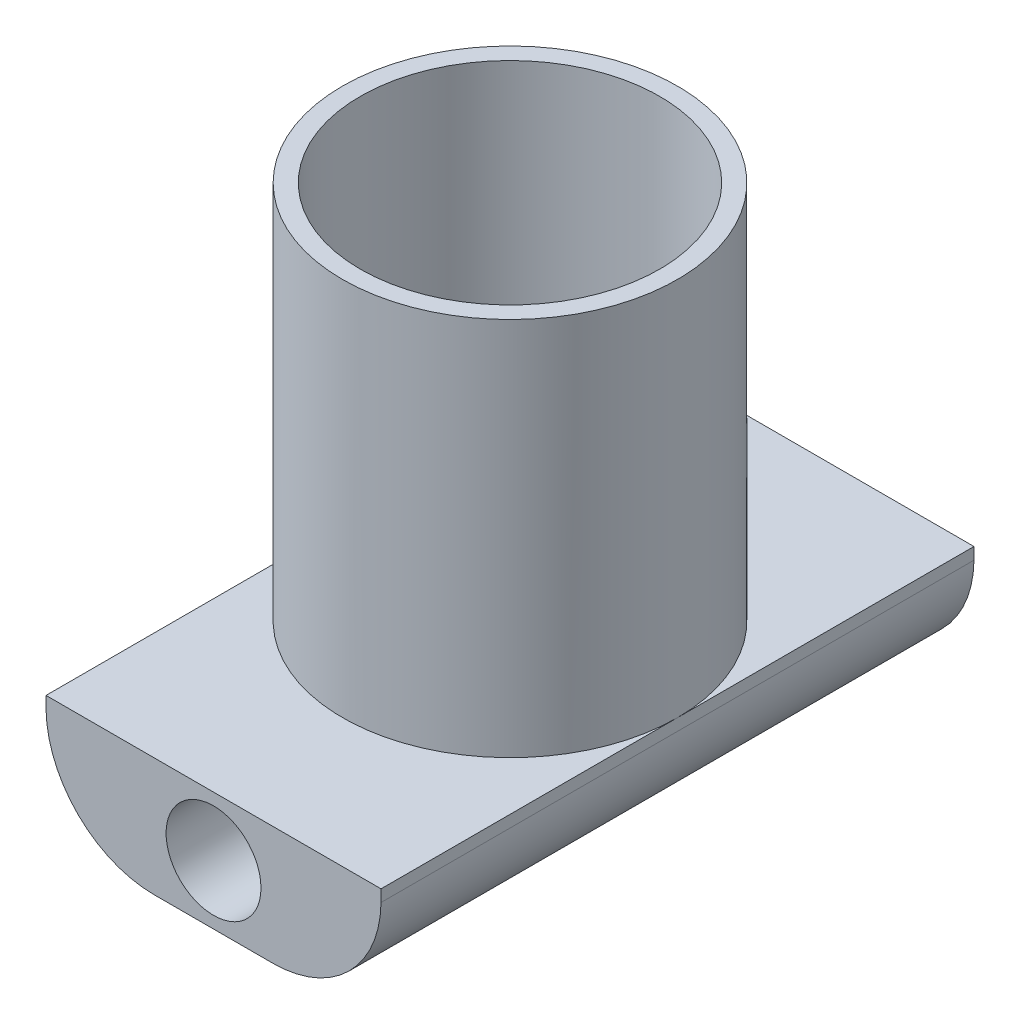
ISO-10303-21;
HEADER;
FILE_DESCRIPTION(('STEP AP214'),'2;1');
FILE_NAME('part.step','',(''),(''),'','','');
FILE_SCHEMA(('AUTOMOTIVE_DESIGN { 1 0 10303 214 1 1 1 1 }'));
ENDSEC;
DATA;
#1=APPLICATION_CONTEXT('core data for automotive mechanical design processes');
#2=APPLICATION_PROTOCOL_DEFINITION('international standard','automotive_design',2000,#1);
#3=PRODUCT_CONTEXT('',#1,'mechanical');
#4=PRODUCT('Part','Part','',(#3));
#5=PRODUCT_RELATED_PRODUCT_CATEGORY('part','',(#4));
#6=PRODUCT_DEFINITION_FORMATION('','',#4);
#7=PRODUCT_DEFINITION_CONTEXT('part definition',#1,'design');
#8=PRODUCT_DEFINITION('design','',#6,#7);
#9=PRODUCT_DEFINITION_SHAPE('','',#8);
#10=(LENGTH_UNIT() NAMED_UNIT(*) SI_UNIT(.MILLI.,.METRE.));
#11=(NAMED_UNIT(*) PLANE_ANGLE_UNIT() SI_UNIT($,.RADIAN.));
#12=(NAMED_UNIT(*) SI_UNIT($,.STERADIAN.) SOLID_ANGLE_UNIT());
#13=UNCERTAINTY_MEASURE_WITH_UNIT(LENGTH_MEASURE(1.E-05),#10,'distance_accuracy_value','');
#14=(GEOMETRIC_REPRESENTATION_CONTEXT(3) GLOBAL_UNCERTAINTY_ASSIGNED_CONTEXT((#13)) GLOBAL_UNIT_ASSIGNED_CONTEXT((#10,
#11,#12)) REPRESENTATION_CONTEXT('',''));
#15=CARTESIAN_POINT('',(0.,0.,0.));
#16=DIRECTION('',(0.,0.,1.));
#17=DIRECTION('',(1.,0.,0.));
#18=AXIS2_PLACEMENT_3D('',#15,#16,#17);
#19=CARTESIAN_POINT('',(0.,30.,0.));
#20=DIRECTION('',(0.,1.,0.));
#21=DIRECTION('',(0.,0.,1.));
#22=AXIS2_PLACEMENT_3D('',#19,#20,#21);
#23=PLANE('',#22);
#24=CARTESIAN_POINT('',(0.,30.,0.));
#25=DIRECTION('',(0.,1.,0.));
#26=DIRECTION('',(0.,0.,1.));
#27=AXIS2_PLACEMENT_3D('',#24,#25,#26);
#28=CIRCLE('',#27,14.125);
#29=CARTESIAN_POINT('',(0.,30.,14.125));
#30=VERTEX_POINT('',#29);
#31=EDGE_CURVE('E162',#30,#30,#28,.T.);
#32=ORIENTED_EDGE('',*,*,#31,.T.);
#33=EDGE_LOOP('',(#32));
#34=FACE_BOUND('',#33,.T.);
#35=CARTESIAN_POINT('',(0.,30.,0.));
#36=DIRECTION('',(0.,1.,0.));
#37=DIRECTION('',(0.,0.,1.));
#38=AXIS2_PLACEMENT_3D('',#35,#36,#37);
#39=CIRCLE('',#38,12.625);
#40=CARTESIAN_POINT('',(0.,30.,12.625));
#41=VERTEX_POINT('',#40);
#42=EDGE_CURVE('E159',#41,#41,#39,.T.);
#43=ORIENTED_EDGE('',*,*,#42,.F.);
#44=EDGE_LOOP('',(#43));
#45=FACE_BOUND('',#44,.T.);
#46=ADVANCED_FACE('F35',(#34,#45),#23,.T.);
#47=CARTESIAN_POINT('',(0.,30.,0.));
#48=DIRECTION('',(0.,-1.,0.));
#49=DIRECTION('',(0.,0.,-1.));
#50=AXIS2_PLACEMENT_3D('',#47,#48,#49);
#51=CYLINDRICAL_SURFACE('',#50,14.125);
#52=CARTESIAN_POINT('',(0.,-2.,0.));
#53=DIRECTION('',(0.,1.,0.));
#54=DIRECTION('',(-1.,0.,0.));
#55=AXIS2_PLACEMENT_3D('',#52,#53,#54);
#56=CIRCLE('',#55,14.125);
#57=CARTESIAN_POINT('',(14.125,-2.,0.));
#58=VERTEX_POINT('',#57);
#59=CARTESIAN_POINT('',(-14.125,-2.,0.));
#60=VERTEX_POINT('',#59);
#61=EDGE_CURVE('E39',#58,#60,#56,.T.);
#62=ORIENTED_EDGE('',*,*,#61,.T.);
#63=EDGE_CURVE('E11',#60,#58,#56,.T.);
#64=ORIENTED_EDGE('',*,*,#63,.T.);
#65=EDGE_LOOP('',(#62,#64));
#66=FACE_BOUND('',#65,.T.);
#67=ORIENTED_EDGE('',*,*,#31,.F.);
#68=EDGE_LOOP('',(#67));
#69=FACE_BOUND('',#68,.T.);
#70=ADVANCED_FACE('F37',(#66,#69),#51,.T.);
#71=CARTESIAN_POINT('',(0.,30.,0.));
#72=DIRECTION('',(0.,-1.,0.));
#73=DIRECTION('',(0.,0.,-1.));
#74=AXIS2_PLACEMENT_3D('',#71,#72,#73);
#75=CYLINDRICAL_SURFACE('',#74,12.625);
#76=ORIENTED_EDGE('',*,*,#42,.T.);
#77=EDGE_LOOP('',(#76));
#78=FACE_BOUND('',#77,.T.);
#79=CARTESIAN_POINT('',(0.,0.,0.));
#80=DIRECTION('',(0.,1.,0.));
#81=DIRECTION('',(0.,0.,1.));
#82=AXIS2_PLACEMENT_3D('',#79,#80,#81);
#83=CIRCLE('',#82,12.625);
#84=CARTESIAN_POINT('',(0.,0.,12.625));
#85=VERTEX_POINT('',#84);
#86=EDGE_CURVE('E151',#85,#85,#83,.T.);
#87=ORIENTED_EDGE('',*,*,#86,.F.);
#88=EDGE_LOOP('',(#87));
#89=FACE_BOUND('',#88,.T.);
#90=ADVANCED_FACE('F170',(#78,#89),#75,.F.);
#91=CARTESIAN_POINT('',(0.,0.,0.));
#92=DIRECTION('',(0.,-1.,0.));
#93=DIRECTION('',(0.,0.,-1.));
#94=AXIS2_PLACEMENT_3D('',#91,#92,#93);
#95=PLANE('',#94);
#96=ORIENTED_EDGE('',*,*,#86,.T.);
#97=EDGE_LOOP('',(#96));
#98=FACE_BOUND('',#97,.T.);
#99=ADVANCED_FACE('F175',(#98),#95,.F.);
#100=CARTESIAN_POINT('',(0.,-2.,-25.));
#101=DIRECTION('',(0.,1.,0.));
#102=DIRECTION('',(-1.,0.,0.));
#103=AXIS2_PLACEMENT_3D('',#100,#101,#102);
#104=PLANE('',#103);
#105=ORIENTED_EDGE('',*,*,#63,.F.);
#106=DIRECTION('',(0.,0.,1.));
#107=VECTOR('',#106,1.);
#108=CARTESIAN_POINT('',(-14.125,-2.,-25.));
#109=LINE('',#108,#107);
#110=CARTESIAN_POINT('',(-14.125,-2.,25.));
#111=VERTEX_POINT('',#110);
#112=EDGE_CURVE('E108',#60,#111,#109,.T.);
#113=ORIENTED_EDGE('',*,*,#112,.T.);
#114=DIRECTION('',(-1.,0.,0.));
#115=VECTOR('',#114,1.);
#116=CARTESIAN_POINT('',(0.,-2.,25.));
#117=LINE('',#116,#115);
#118=CARTESIAN_POINT('',(14.125,-2.,25.));
#119=VERTEX_POINT('',#118);
#120=EDGE_CURVE('E106',#119,#111,#117,.T.);
#121=ORIENTED_EDGE('',*,*,#120,.F.);
#122=DIRECTION('',(0.,0.,1.));
#123=VECTOR('',#122,1.);
#124=CARTESIAN_POINT('',(14.125,-2.,-25.));
#125=LINE('',#124,#123);
#126=EDGE_CURVE('E92',#58,#119,#125,.T.);
#127=ORIENTED_EDGE('',*,*,#126,.F.);
#128=EDGE_LOOP('',(#105,#113,#121,#127));
#129=FACE_BOUND('',#128,.T.);
#130=ADVANCED_FACE('F107',(#129),#104,.T.);
#131=CARTESIAN_POINT('',(14.125,0.,-25.));
#132=DIRECTION('',(-1.,0.,0.));
#133=DIRECTION('',(0.,0.,1.));
#134=AXIS2_PLACEMENT_3D('',#131,#132,#133);
#135=PLANE('',#134);
#136=CARTESIAN_POINT('',(14.125,-2.,-25.));
#137=VERTEX_POINT('',#136);
#138=EDGE_CURVE('E100',#137,#58,#125,.T.);
#139=ORIENTED_EDGE('',*,*,#138,.T.);
#140=ORIENTED_EDGE('',*,*,#126,.T.);
#141=DIRECTION('',(0.,-1.,0.));
#142=VECTOR('',#141,1.);
#143=CARTESIAN_POINT('',(14.125,0.,25.));
#144=LINE('',#143,#142);
#145=CARTESIAN_POINT('',(14.125,-3.,25.));
#146=VERTEX_POINT('',#145);
#147=EDGE_CURVE('E97',#119,#146,#144,.T.);
#148=ORIENTED_EDGE('',*,*,#147,.T.);
#149=DIRECTION('',(0.,0.,1.));
#150=VECTOR('',#149,1.);
#151=CARTESIAN_POINT('',(14.125,-3.,-25.));
#152=LINE('',#151,#150);
#153=CARTESIAN_POINT('',(14.125,-3.,-25.));
#154=VERTEX_POINT('',#153);
#155=EDGE_CURVE('E149',#154,#146,#152,.T.);
#156=ORIENTED_EDGE('',*,*,#155,.F.);
#157=DIRECTION('',(0.,-1.,0.));
#158=VECTOR('',#157,1.);
#159=CARTESIAN_POINT('',(14.125,0.,-25.));
#160=LINE('',#159,#158);
#161=EDGE_CURVE('E132',#137,#154,#160,.T.);
#162=ORIENTED_EDGE('',*,*,#161,.F.);
#163=EDGE_LOOP('',(#139,#140,#148,#156,#162));
#164=FACE_BOUND('',#163,.T.);
#165=ADVANCED_FACE('F94',(#164),#135,.F.);
#166=CARTESIAN_POINT('',(-14.125,0.,-25.));
#167=DIRECTION('',(-1.,0.,0.));
#168=DIRECTION('',(0.,0.,1.));
#169=AXIS2_PLACEMENT_3D('',#166,#167,#168);
#170=PLANE('',#169);
#171=DIRECTION('',(0.,0.,1.));
#172=VECTOR('',#171,1.);
#173=CARTESIAN_POINT('',(-14.125,-3.,-25.));
#174=LINE('',#173,#172);
#175=CARTESIAN_POINT('',(-14.125,-3.,-25.));
#176=VERTEX_POINT('',#175);
#177=CARTESIAN_POINT('',(-14.125,-3.,25.));
#178=VERTEX_POINT('',#177);
#179=EDGE_CURVE('E156',#176,#178,#174,.T.);
#180=ORIENTED_EDGE('',*,*,#179,.T.);
#181=DIRECTION('',(0.,-1.,0.));
#182=VECTOR('',#181,1.);
#183=CARTESIAN_POINT('',(-14.125,0.,25.));
#184=LINE('',#183,#182);
#185=EDGE_CURVE('E112',#111,#178,#184,.T.);
#186=ORIENTED_EDGE('',*,*,#185,.F.);
#187=ORIENTED_EDGE('',*,*,#112,.F.);
#188=CARTESIAN_POINT('',(-14.125,-2.,-25.));
#189=VERTEX_POINT('',#188);
#190=EDGE_CURVE('E50',#189,#60,#109,.T.);
#191=ORIENTED_EDGE('',*,*,#190,.F.);
#192=DIRECTION('',(0.,-1.,0.));
#193=VECTOR('',#192,1.);
#194=CARTESIAN_POINT('',(-14.125,0.,-25.));
#195=LINE('',#194,#193);
#196=EDGE_CURVE('E137',#189,#176,#195,.T.);
#197=ORIENTED_EDGE('',*,*,#196,.T.);
#198=EDGE_LOOP('',(#180,#186,#187,#191,#197));
#199=FACE_BOUND('',#198,.T.);
#200=ADVANCED_FACE('F187',(#199),#170,.T.);
#201=CARTESIAN_POINT('',(5.,-2.87413194444445,-25.));
#202=DIRECTION('',(0.,0.,1.));
#203=DIRECTION('',(1.,0.,0.));
#204=AXIS2_PLACEMENT_3D('',#201,#202,#203);
#205=CYLINDRICAL_SURFACE('',#204,9.12586805555555);
#206=ORIENTED_EDGE('',*,*,#155,.T.);
#207=CARTESIAN_POINT('',(5.,-2.87413194444445,25.));
#208=DIRECTION('',(0.,0.,1.));
#209=DIRECTION('',(1.,0.,0.));
#210=AXIS2_PLACEMENT_3D('',#207,#208,#209);
#211=CIRCLE('',#210,9.12586805555555);
#212=CARTESIAN_POINT('',(5.,-12.,25.));
#213=VERTEX_POINT('',#212);
#214=EDGE_CURVE('E118',#146,#213,#211,.F.);
#215=ORIENTED_EDGE('',*,*,#214,.T.);
#216=DIRECTION('',(0.,0.,1.));
#217=VECTOR('',#216,1.);
#218=CARTESIAN_POINT('',(5.,-12.,-25.));
#219=LINE('',#218,#217);
#220=CARTESIAN_POINT('',(5.,-12.,-25.));
#221=VERTEX_POINT('',#220);
#222=EDGE_CURVE('E152',#221,#213,#219,.T.);
#223=ORIENTED_EDGE('',*,*,#222,.F.);
#224=CARTESIAN_POINT('',(5.,-2.87413194444445,-25.));
#225=DIRECTION('',(0.,0.,1.));
#226=DIRECTION('',(1.,0.,0.));
#227=AXIS2_PLACEMENT_3D('',#224,#225,#226);
#228=CIRCLE('',#227,9.12586805555555);
#229=EDGE_CURVE('E145',#154,#221,#228,.F.);
#230=ORIENTED_EDGE('',*,*,#229,.F.);
#231=EDGE_LOOP('',(#206,#215,#223,#230));
#232=FACE_BOUND('',#231,.T.);
#233=ADVANCED_FACE('F195',(#232),#205,.T.);
#234=CARTESIAN_POINT('',(0.,-12.,-25.));
#235=DIRECTION('',(0.,1.,0.));
#236=DIRECTION('',(0.,0.,1.));
#237=AXIS2_PLACEMENT_3D('',#234,#235,#236);
#238=PLANE('',#237);
#239=ORIENTED_EDGE('',*,*,#222,.T.);
#240=DIRECTION('',(-1.,0.,0.));
#241=VECTOR('',#240,1.);
#242=CARTESIAN_POINT('',(0.,-12.,25.));
#243=LINE('',#242,#241);
#244=CARTESIAN_POINT('',(-5.,-12.,25.));
#245=VERTEX_POINT('',#244);
#246=EDGE_CURVE('E125',#213,#245,#243,.T.);
#247=ORIENTED_EDGE('',*,*,#246,.T.);
#248=DIRECTION('',(0.,0.,1.));
#249=VECTOR('',#248,1.);
#250=CARTESIAN_POINT('',(-5.,-12.,-25.));
#251=LINE('',#250,#249);
#252=CARTESIAN_POINT('',(-5.,-12.,-25.));
#253=VERTEX_POINT('',#252);
#254=EDGE_CURVE('E154',#253,#245,#251,.T.);
#255=ORIENTED_EDGE('',*,*,#254,.F.);
#256=DIRECTION('',(-1.,0.,0.));
#257=VECTOR('',#256,1.);
#258=CARTESIAN_POINT('',(0.,-12.,-25.));
#259=LINE('',#258,#257);
#260=EDGE_CURVE('E143',#221,#253,#259,.T.);
#261=ORIENTED_EDGE('',*,*,#260,.F.);
#262=EDGE_LOOP('',(#239,#247,#255,#261));
#263=FACE_BOUND('',#262,.T.);
#264=ADVANCED_FACE('F199',(#263),#238,.F.);
#265=CARTESIAN_POINT('',(-5.,-2.87413194444445,-25.));
#266=DIRECTION('',(0.,0.,1.));
#267=DIRECTION('',(1.,0.,0.));
#268=AXIS2_PLACEMENT_3D('',#265,#266,#267);
#269=CYLINDRICAL_SURFACE('',#268,9.12586805555556);
#270=ORIENTED_EDGE('',*,*,#254,.T.);
#271=CARTESIAN_POINT('',(-5.,-2.87413194444445,25.));
#272=DIRECTION('',(0.,0.,1.));
#273=DIRECTION('',(1.,0.,0.));
#274=AXIS2_PLACEMENT_3D('',#271,#272,#273);
#275=CIRCLE('',#274,9.12586805555556);
#276=EDGE_CURVE('E122',#178,#245,#275,.T.);
#277=ORIENTED_EDGE('',*,*,#276,.F.);
#278=ORIENTED_EDGE('',*,*,#179,.F.);
#279=CARTESIAN_POINT('',(-5.,-2.87413194444445,-25.));
#280=DIRECTION('',(0.,0.,1.));
#281=DIRECTION('',(1.,0.,0.));
#282=AXIS2_PLACEMENT_3D('',#279,#280,#281);
#283=CIRCLE('',#282,9.12586805555556);
#284=EDGE_CURVE('E140',#176,#253,#283,.T.);
#285=ORIENTED_EDGE('',*,*,#284,.T.);
#286=EDGE_LOOP('',(#270,#277,#278,#285));
#287=FACE_BOUND('',#286,.T.);
#288=ADVANCED_FACE('F192',(#287),#269,.T.);
#289=ORIENTED_EDGE('',*,*,#61,.F.);
#290=ORIENTED_EDGE('',*,*,#138,.F.);
#291=DIRECTION('',(-1.,0.,0.));
#292=VECTOR('',#291,1.);
#293=CARTESIAN_POINT('',(0.,-2.,-25.));
#294=LINE('',#293,#292);
#295=EDGE_CURVE('E135',#137,#189,#294,.T.);
#296=ORIENTED_EDGE('',*,*,#295,.T.);
#297=ORIENTED_EDGE('',*,*,#190,.T.);
#298=EDGE_LOOP('',(#289,#290,#296,#297));
#299=FACE_BOUND('',#298,.T.);
#300=ADVANCED_FACE('F188',(#299),#104,.T.);
#301=CARTESIAN_POINT('',(0.,-7.,-25.));
#302=DIRECTION('',(0.,0.,1.));
#303=DIRECTION('',(1.,0.,0.));
#304=AXIS2_PLACEMENT_3D('',#301,#302,#303);
#305=CYLINDRICAL_SURFACE('',#304,4.);
#306=CARTESIAN_POINT('',(0.,-7.,-25.));
#307=DIRECTION('',(0.,0.,1.));
#308=DIRECTION('',(1.,0.,0.));
#309=AXIS2_PLACEMENT_3D('',#306,#307,#308);
#310=CIRCLE('',#309,4.);
#311=CARTESIAN_POINT('',(4.,-7.,-25.));
#312=VERTEX_POINT('',#311);
#313=EDGE_CURVE('E103',#312,#312,#310,.T.);
#314=ORIENTED_EDGE('',*,*,#313,.F.);
#315=EDGE_LOOP('',(#314));
#316=FACE_BOUND('',#315,.T.);
#317=CARTESIAN_POINT('',(0.,-7.,25.));
#318=DIRECTION('',(0.,0.,1.));
#319=DIRECTION('',(1.,0.,0.));
#320=AXIS2_PLACEMENT_3D('',#317,#318,#319);
#321=CIRCLE('',#320,4.);
#322=CARTESIAN_POINT('',(4.,-7.,25.));
#323=VERTEX_POINT('',#322);
#324=EDGE_CURVE('E129',#323,#323,#321,.T.);
#325=ORIENTED_EDGE('',*,*,#324,.T.);
#326=EDGE_LOOP('',(#325));
#327=FACE_BOUND('',#326,.T.);
#328=ADVANCED_FACE('F191',(#316,#327),#305,.F.);
#329=CARTESIAN_POINT('',(0.,0.,-25.));
#330=DIRECTION('',(0.,0.,1.));
#331=DIRECTION('',(1.,0.,0.));
#332=AXIS2_PLACEMENT_3D('',#329,#330,#331);
#333=PLANE('',#332);
#334=ORIENTED_EDGE('',*,*,#161,.T.);
#335=ORIENTED_EDGE('',*,*,#229,.T.);
#336=ORIENTED_EDGE('',*,*,#260,.T.);
#337=ORIENTED_EDGE('',*,*,#284,.F.);
#338=ORIENTED_EDGE('',*,*,#196,.F.);
#339=ORIENTED_EDGE('',*,*,#295,.F.);
#340=EDGE_LOOP('',(#334,#335,#336,#337,#338,#339));
#341=FACE_BOUND('',#340,.T.);
#342=ORIENTED_EDGE('',*,*,#313,.T.);
#343=EDGE_LOOP('',(#342));
#344=FACE_BOUND('',#343,.T.);
#345=ADVANCED_FACE('F209',(#341,#344),#333,.F.);
#346=CARTESIAN_POINT('',(0.,0.,25.));
#347=DIRECTION('',(0.,0.,1.));
#348=DIRECTION('',(1.,0.,0.));
#349=AXIS2_PLACEMENT_3D('',#346,#347,#348);
#350=PLANE('',#349);
#351=ORIENTED_EDGE('',*,*,#147,.F.);
#352=ORIENTED_EDGE('',*,*,#120,.T.);
#353=ORIENTED_EDGE('',*,*,#185,.T.);
#354=ORIENTED_EDGE('',*,*,#276,.T.);
#355=ORIENTED_EDGE('',*,*,#246,.F.);
#356=ORIENTED_EDGE('',*,*,#214,.F.);
#357=EDGE_LOOP('',(#351,#352,#353,#354,#355,#356));
#358=FACE_BOUND('',#357,.T.);
#359=ORIENTED_EDGE('',*,*,#324,.F.);
#360=EDGE_LOOP('',(#359));
#361=FACE_BOUND('',#360,.T.);
#362=ADVANCED_FACE('F114',(#358,#361),#350,.T.);
#363=CLOSED_SHELL('',(#46,#70,#90,#99,#130,#165,#200,#233,#264,#288,#300,#328,#345,#362));
#364=MANIFOLD_SOLID_BREP('B2',#363);
#365=ADVANCED_BREP_SHAPE_REPRESENTATION('',(#18,#364),#14);
#366=SHAPE_DEFINITION_REPRESENTATION(#9,#365);
ENDSEC;
END-ISO-10303-21;
